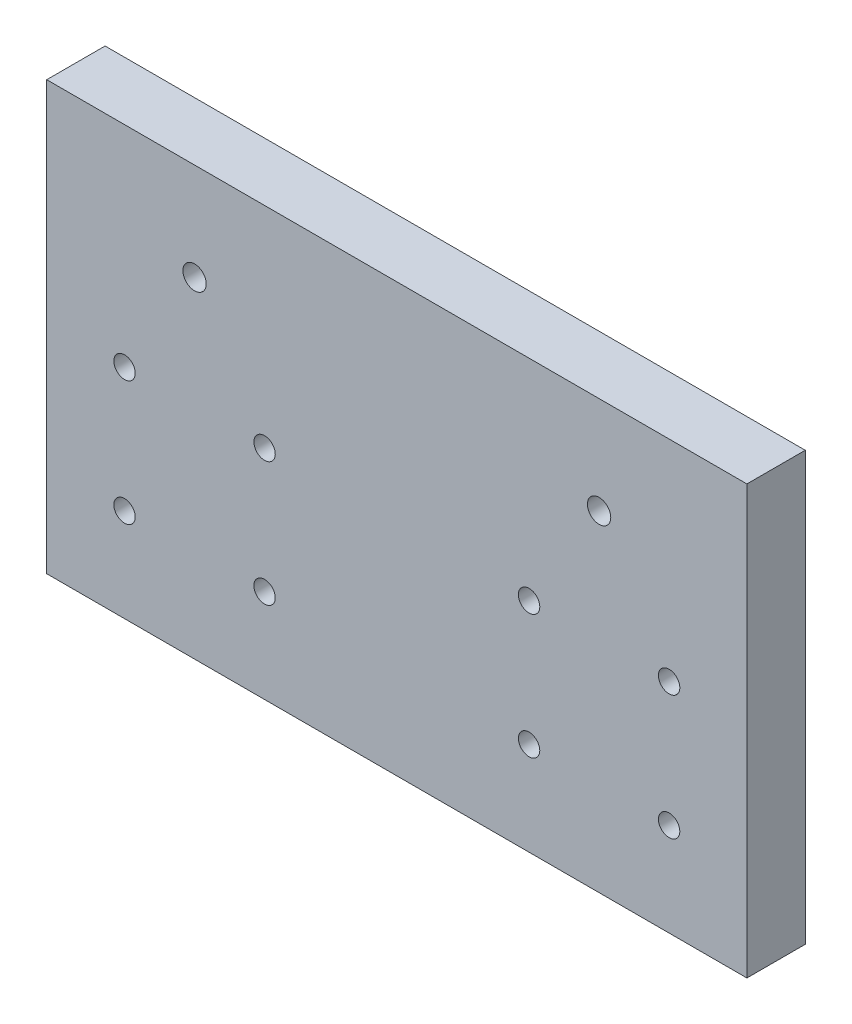
ISO-10303-21;
HEADER;
FILE_DESCRIPTION(('STEP AP214'),'2;1');
FILE_NAME('part.step','',(''),(''),'','','');
FILE_SCHEMA(('AUTOMOTIVE_DESIGN { 1 0 10303 214 1 1 1 1 }'));
ENDSEC;
DATA;
#1=APPLICATION_CONTEXT('core data for automotive mechanical design processes');
#2=APPLICATION_PROTOCOL_DEFINITION('international standard','automotive_design',2000,#1);
#3=PRODUCT_CONTEXT('',#1,'mechanical');
#4=PRODUCT('Part','Part','',(#3));
#5=PRODUCT_RELATED_PRODUCT_CATEGORY('part','',(#4));
#6=PRODUCT_DEFINITION_FORMATION('','',#4);
#7=PRODUCT_DEFINITION_CONTEXT('part definition',#1,'design');
#8=PRODUCT_DEFINITION('design','',#6,#7);
#9=PRODUCT_DEFINITION_SHAPE('','',#8);
#10=(LENGTH_UNIT() NAMED_UNIT(*) SI_UNIT(.MILLI.,.METRE.));
#11=(NAMED_UNIT(*) PLANE_ANGLE_UNIT() SI_UNIT($,.RADIAN.));
#12=(NAMED_UNIT(*) SI_UNIT($,.STERADIAN.) SOLID_ANGLE_UNIT());
#13=UNCERTAINTY_MEASURE_WITH_UNIT(LENGTH_MEASURE(1.E-05),#10,'distance_accuracy_value','');
#14=(GEOMETRIC_REPRESENTATION_CONTEXT(3) GLOBAL_UNCERTAINTY_ASSIGNED_CONTEXT((#13)) GLOBAL_UNIT_ASSIGNED_CONTEXT((#10,
#11,#12)) REPRESENTATION_CONTEXT('',''));
#15=CARTESIAN_POINT('',(0.,0.,0.));
#16=DIRECTION('',(0.,0.,1.));
#17=DIRECTION('',(1.,0.,0.));
#18=AXIS2_PLACEMENT_3D('',#15,#16,#17);
#19=CARTESIAN_POINT('',(-90.,0.,15.));
#20=DIRECTION('',(1.,0.,0.));
#21=DIRECTION('',(0.,0.,-1.));
#22=AXIS2_PLACEMENT_3D('',#19,#20,#21);
#23=PLANE('',#22);
#24=DIRECTION('',(0.,-1.,0.));
#25=VECTOR('',#24,1.);
#26=CARTESIAN_POINT('',(-90.,0.,0.));
#27=LINE('',#26,#25);
#28=CARTESIAN_POINT('',(-90.,110.,0.));
#29=VERTEX_POINT('',#28);
#30=CARTESIAN_POINT('',(-90.,0.,0.));
#31=VERTEX_POINT('',#30);
#32=EDGE_CURVE('E101',#29,#31,#27,.T.);
#33=ORIENTED_EDGE('',*,*,#32,.T.);
#34=DIRECTION('',(0.,0.,-1.));
#35=VECTOR('',#34,1.);
#36=CARTESIAN_POINT('',(-90.,0.,15.));
#37=LINE('',#36,#35);
#38=CARTESIAN_POINT('',(-90.,0.,15.));
#39=VERTEX_POINT('',#38);
#40=EDGE_CURVE('E11',#39,#31,#37,.T.);
#41=ORIENTED_EDGE('',*,*,#40,.F.);
#42=DIRECTION('',(0.,-1.,0.));
#43=VECTOR('',#42,1.);
#44=CARTESIAN_POINT('',(-90.,0.,15.));
#45=LINE('',#44,#43);
#46=CARTESIAN_POINT('',(-90.,110.,15.));
#47=VERTEX_POINT('',#46);
#48=EDGE_CURVE('E88',#47,#39,#45,.T.);
#49=ORIENTED_EDGE('',*,*,#48,.F.);
#50=DIRECTION('',(0.,0.,-1.));
#51=VECTOR('',#50,1.);
#52=CARTESIAN_POINT('',(-90.,110.,15.));
#53=LINE('',#52,#51);
#54=EDGE_CURVE('E97',#47,#29,#53,.T.);
#55=ORIENTED_EDGE('',*,*,#54,.T.);
#56=EDGE_LOOP('',(#33,#41,#49,#55));
#57=FACE_BOUND('',#56,.T.);
#58=ADVANCED_FACE('F35',(#57),#23,.F.);
#59=CARTESIAN_POINT('',(-90.,0.,15.));
#60=DIRECTION('',(0.,1.,0.));
#61=DIRECTION('',(0.,0.,1.));
#62=AXIS2_PLACEMENT_3D('',#59,#60,#61);
#63=PLANE('',#62);
#64=DIRECTION('',(1.,0.,0.));
#65=VECTOR('',#64,1.);
#66=CARTESIAN_POINT('',(-90.,0.,0.));
#67=LINE('',#66,#65);
#68=CARTESIAN_POINT('',(90.,0.,0.));
#69=VERTEX_POINT('',#68);
#70=EDGE_CURVE('E92',#31,#69,#67,.T.);
#71=ORIENTED_EDGE('',*,*,#70,.T.);
#72=DIRECTION('',(0.,0.,-1.));
#73=VECTOR('',#72,1.);
#74=CARTESIAN_POINT('',(90.,0.,15.));
#75=LINE('',#74,#73);
#76=CARTESIAN_POINT('',(90.,0.,15.));
#77=VERTEX_POINT('',#76);
#78=EDGE_CURVE('E44',#77,#69,#75,.T.);
#79=ORIENTED_EDGE('',*,*,#78,.F.);
#80=DIRECTION('',(1.,0.,0.));
#81=VECTOR('',#80,1.);
#82=CARTESIAN_POINT('',(-90.,0.,15.));
#83=LINE('',#82,#81);
#84=EDGE_CURVE('E83',#39,#77,#83,.T.);
#85=ORIENTED_EDGE('',*,*,#84,.F.);
#86=ORIENTED_EDGE('',*,*,#40,.T.);
#87=EDGE_LOOP('',(#71,#79,#85,#86));
#88=FACE_BOUND('',#87,.T.);
#89=ADVANCED_FACE('F91',(#88),#63,.F.);
#90=CARTESIAN_POINT('',(90.,0.,15.));
#91=DIRECTION('',(-1.,0.,0.));
#92=DIRECTION('',(0.,0.,1.));
#93=AXIS2_PLACEMENT_3D('',#90,#91,#92);
#94=PLANE('',#93);
#95=DIRECTION('',(0.,1.,0.));
#96=VECTOR('',#95,1.);
#97=CARTESIAN_POINT('',(90.,0.,0.));
#98=LINE('',#97,#96);
#99=CARTESIAN_POINT('',(90.,110.,0.));
#100=VERTEX_POINT('',#99);
#101=EDGE_CURVE('E70',#69,#100,#98,.T.);
#102=ORIENTED_EDGE('',*,*,#101,.T.);
#103=DIRECTION('',(0.,0.,-1.));
#104=VECTOR('',#103,1.);
#105=CARTESIAN_POINT('',(90.,110.,15.));
#106=LINE('',#105,#104);
#107=CARTESIAN_POINT('',(90.,110.,15.));
#108=VERTEX_POINT('',#107);
#109=EDGE_CURVE('E93',#108,#100,#106,.T.);
#110=ORIENTED_EDGE('',*,*,#109,.F.);
#111=DIRECTION('',(0.,1.,0.));
#112=VECTOR('',#111,1.);
#113=CARTESIAN_POINT('',(90.,0.,15.));
#114=LINE('',#113,#112);
#115=EDGE_CURVE('E86',#77,#108,#114,.T.);
#116=ORIENTED_EDGE('',*,*,#115,.F.);
#117=ORIENTED_EDGE('',*,*,#78,.T.);
#118=EDGE_LOOP('',(#102,#110,#116,#117));
#119=FACE_BOUND('',#118,.T.);
#120=ADVANCED_FACE('F95',(#119),#94,.F.);
#121=CARTESIAN_POINT('',(-90.,110.,15.));
#122=DIRECTION('',(0.,-1.,0.));
#123=DIRECTION('',(0.,0.,-1.));
#124=AXIS2_PLACEMENT_3D('',#121,#122,#123);
#125=PLANE('',#124);
#126=DIRECTION('',(-1.,0.,0.));
#127=VECTOR('',#126,1.);
#128=CARTESIAN_POINT('',(-90.,110.,0.));
#129=LINE('',#128,#127);
#130=EDGE_CURVE('E76',#100,#29,#129,.T.);
#131=ORIENTED_EDGE('',*,*,#130,.T.);
#132=ORIENTED_EDGE('',*,*,#54,.F.);
#133=DIRECTION('',(-1.,0.,0.));
#134=VECTOR('',#133,1.);
#135=CARTESIAN_POINT('',(-90.,110.,15.));
#136=LINE('',#135,#134);
#137=EDGE_CURVE('E53',#108,#47,#136,.T.);
#138=ORIENTED_EDGE('',*,*,#137,.F.);
#139=ORIENTED_EDGE('',*,*,#109,.T.);
#140=EDGE_LOOP('',(#131,#132,#138,#139));
#141=FACE_BOUND('',#140,.T.);
#142=ADVANCED_FACE('F175',(#141),#125,.F.);
#143=CARTESIAN_POINT('',(0.,0.,15.));
#144=DIRECTION('',(0.,0.,-1.));
#145=DIRECTION('',(-1.,0.,0.));
#146=AXIS2_PLACEMENT_3D('',#143,#144,#145);
#147=PLANE('',#146);
#148=CARTESIAN_POINT('',(52.,85.,15.));
#149=DIRECTION('',(0.,0.,1.));
#150=DIRECTION('',(1.,0.,0.));
#151=AXIS2_PLACEMENT_3D('',#148,#149,#150);
#152=CIRCLE('',#151,3.);
#153=CARTESIAN_POINT('',(55.,85.,15.));
#154=VERTEX_POINT('',#153);
#155=EDGE_CURVE('E135',#154,#154,#152,.T.);
#156=ORIENTED_EDGE('',*,*,#155,.F.);
#157=EDGE_LOOP('',(#156));
#158=FACE_BOUND('',#157,.T.);
#159=CARTESIAN_POINT('',(-52.,85.,15.));
#160=DIRECTION('',(0.,0.,1.));
#161=DIRECTION('',(-1.,0.,0.));
#162=AXIS2_PLACEMENT_3D('',#159,#160,#161);
#163=CIRCLE('',#162,3.);
#164=CARTESIAN_POINT('',(-55.,85.,15.));
#165=VERTEX_POINT('',#164);
#166=EDGE_CURVE('E141',#165,#165,#163,.T.);
#167=ORIENTED_EDGE('',*,*,#166,.F.);
#168=EDGE_LOOP('',(#167));
#169=FACE_BOUND('',#168,.T.);
#170=CARTESIAN_POINT('',(70.,24.,15.));
#171=DIRECTION('',(0.,0.,1.));
#172=DIRECTION('',(1.,0.,0.));
#173=AXIS2_PLACEMENT_3D('',#170,#171,#172);
#174=CIRCLE('',#173,2.75000000000001);
#175=CARTESIAN_POINT('',(72.75,24.,15.));
#176=VERTEX_POINT('',#175);
#177=EDGE_CURVE('E157',#176,#176,#174,.T.);
#178=ORIENTED_EDGE('',*,*,#177,.F.);
#179=EDGE_LOOP('',(#178));
#180=FACE_BOUND('',#179,.T.);
#181=CARTESIAN_POINT('',(70.,56.,15.));
#182=DIRECTION('',(0.,0.,1.));
#183=DIRECTION('',(-1.,0.,0.));
#184=AXIS2_PLACEMENT_3D('',#181,#182,#183);
#185=CIRCLE('',#184,2.75000000000001);
#186=CARTESIAN_POINT('',(67.25,56.,15.));
#187=VERTEX_POINT('',#186);
#188=EDGE_CURVE('E160',#187,#187,#185,.T.);
#189=ORIENTED_EDGE('',*,*,#188,.F.);
#190=EDGE_LOOP('',(#189));
#191=FACE_BOUND('',#190,.T.);
#192=CARTESIAN_POINT('',(34.,56.,15.));
#193=DIRECTION('',(0.,0.,1.));
#194=DIRECTION('',(-1.,0.,0.));
#195=AXIS2_PLACEMENT_3D('',#192,#193,#194);
#196=CIRCLE('',#195,2.75);
#197=CARTESIAN_POINT('',(31.25,56.,15.));
#198=VERTEX_POINT('',#197);
#199=EDGE_CURVE('E163',#198,#198,#196,.T.);
#200=ORIENTED_EDGE('',*,*,#199,.F.);
#201=EDGE_LOOP('',(#200));
#202=FACE_BOUND('',#201,.T.);
#203=CARTESIAN_POINT('',(-34.,24.,15.));
#204=DIRECTION('',(0.,0.,1.));
#205=DIRECTION('',(-1.,0.,0.));
#206=AXIS2_PLACEMENT_3D('',#203,#204,#205);
#207=CIRCLE('',#206,2.74999999999999);
#208=CARTESIAN_POINT('',(-36.75,24.,15.));
#209=VERTEX_POINT('',#208);
#210=EDGE_CURVE('E151',#209,#209,#207,.T.);
#211=ORIENTED_EDGE('',*,*,#210,.F.);
#212=EDGE_LOOP('',(#211));
#213=FACE_BOUND('',#212,.T.);
#214=CARTESIAN_POINT('',(-70.,24.,15.));
#215=DIRECTION('',(0.,0.,1.));
#216=DIRECTION('',(-1.,0.,0.));
#217=AXIS2_PLACEMENT_3D('',#214,#215,#216);
#218=CIRCLE('',#217,2.75000000000001);
#219=CARTESIAN_POINT('',(-72.75,24.,15.));
#220=VERTEX_POINT('',#219);
#221=EDGE_CURVE('E148',#220,#220,#218,.T.);
#222=ORIENTED_EDGE('',*,*,#221,.F.);
#223=EDGE_LOOP('',(#222));
#224=FACE_BOUND('',#223,.T.);
#225=CARTESIAN_POINT('',(-70.,56.,15.));
#226=DIRECTION('',(0.,0.,1.));
#227=DIRECTION('',(1.,0.,0.));
#228=AXIS2_PLACEMENT_3D('',#225,#226,#227);
#229=CIRCLE('',#228,2.75000000000001);
#230=CARTESIAN_POINT('',(-67.25,56.,15.));
#231=VERTEX_POINT('',#230);
#232=EDGE_CURVE('E152',#231,#231,#229,.T.);
#233=ORIENTED_EDGE('',*,*,#232,.F.);
#234=EDGE_LOOP('',(#233));
#235=FACE_BOUND('',#234,.T.);
#236=CARTESIAN_POINT('',(-34.,56.,15.));
#237=DIRECTION('',(0.,0.,1.));
#238=DIRECTION('',(1.,0.,0.));
#239=AXIS2_PLACEMENT_3D('',#236,#237,#238);
#240=CIRCLE('',#239,2.75);
#241=CARTESIAN_POINT('',(-31.25,56.,15.));
#242=VERTEX_POINT('',#241);
#243=EDGE_CURVE('E139',#242,#242,#240,.T.);
#244=ORIENTED_EDGE('',*,*,#243,.F.);
#245=EDGE_LOOP('',(#244));
#246=FACE_BOUND('',#245,.T.);
#247=CARTESIAN_POINT('',(34.,24.,15.));
#248=DIRECTION('',(0.,0.,1.));
#249=DIRECTION('',(1.,0.,0.));
#250=AXIS2_PLACEMENT_3D('',#247,#248,#249);
#251=CIRCLE('',#250,2.74999999999999);
#252=CARTESIAN_POINT('',(36.75,24.,15.));
#253=VERTEX_POINT('',#252);
#254=EDGE_CURVE('E114',#253,#253,#251,.T.);
#255=ORIENTED_EDGE('',*,*,#254,.F.);
#256=EDGE_LOOP('',(#255));
#257=FACE_BOUND('',#256,.T.);
#258=ORIENTED_EDGE('',*,*,#48,.T.);
#259=ORIENTED_EDGE('',*,*,#84,.T.);
#260=ORIENTED_EDGE('',*,*,#115,.T.);
#261=ORIENTED_EDGE('',*,*,#137,.T.);
#262=EDGE_LOOP('',(#258,#259,#260,#261));
#263=FACE_BOUND('',#262,.T.);
#264=ADVANCED_FACE('F84',(#158,#169,#180,#191,#202,#213,#224,#235,#246,#257,#263),#147,.F.);
#265=CARTESIAN_POINT('',(0.,0.,0.));
#266=DIRECTION('',(0.,0.,-1.));
#267=DIRECTION('',(-1.,0.,0.));
#268=AXIS2_PLACEMENT_3D('',#265,#266,#267);
#269=PLANE('',#268);
#270=CARTESIAN_POINT('',(52.,85.,0.));
#271=DIRECTION('',(0.,0.,-1.));
#272=DIRECTION('',(-1.,0.,0.));
#273=AXIS2_PLACEMENT_3D('',#270,#271,#272);
#274=CIRCLE('',#273,3.);
#275=CARTESIAN_POINT('',(49.,85.,0.));
#276=VERTEX_POINT('',#275);
#277=EDGE_CURVE('E38',#276,#276,#274,.T.);
#278=ORIENTED_EDGE('',*,*,#277,.F.);
#279=EDGE_LOOP('',(#278));
#280=FACE_BOUND('',#279,.T.);
#281=CARTESIAN_POINT('',(-52.,85.,0.));
#282=DIRECTION('',(0.,0.,-1.));
#283=DIRECTION('',(-1.,0.,0.));
#284=AXIS2_PLACEMENT_3D('',#281,#282,#283);
#285=CIRCLE('',#284,3.);
#286=CARTESIAN_POINT('',(-55.,85.,0.));
#287=VERTEX_POINT('',#286);
#288=EDGE_CURVE('E133',#287,#287,#285,.T.);
#289=ORIENTED_EDGE('',*,*,#288,.F.);
#290=EDGE_LOOP('',(#289));
#291=FACE_BOUND('',#290,.T.);
#292=CARTESIAN_POINT('',(70.,24.,0.));
#293=DIRECTION('',(0.,0.,-1.));
#294=DIRECTION('',(-1.,0.,0.));
#295=AXIS2_PLACEMENT_3D('',#292,#293,#294);
#296=CIRCLE('',#295,2.75000000000001);
#297=CARTESIAN_POINT('',(67.25,24.,0.));
#298=VERTEX_POINT('',#297);
#299=EDGE_CURVE('E104',#298,#298,#296,.T.);
#300=ORIENTED_EDGE('',*,*,#299,.F.);
#301=EDGE_LOOP('',(#300));
#302=FACE_BOUND('',#301,.T.);
#303=CARTESIAN_POINT('',(70.,56.,0.));
#304=DIRECTION('',(0.,0.,-1.));
#305=DIRECTION('',(-1.,0.,0.));
#306=AXIS2_PLACEMENT_3D('',#303,#304,#305);
#307=CIRCLE('',#306,2.75000000000001);
#308=CARTESIAN_POINT('',(67.25,56.,0.));
#309=VERTEX_POINT('',#308);
#310=EDGE_CURVE('E129',#309,#309,#307,.T.);
#311=ORIENTED_EDGE('',*,*,#310,.F.);
#312=EDGE_LOOP('',(#311));
#313=FACE_BOUND('',#312,.T.);
#314=CARTESIAN_POINT('',(34.,56.,0.));
#315=DIRECTION('',(0.,0.,-1.));
#316=DIRECTION('',(-1.,0.,0.));
#317=AXIS2_PLACEMENT_3D('',#314,#315,#316);
#318=CIRCLE('',#317,2.75);
#319=CARTESIAN_POINT('',(31.25,56.,0.));
#320=VERTEX_POINT('',#319);
#321=EDGE_CURVE('E126',#320,#320,#318,.T.);
#322=ORIENTED_EDGE('',*,*,#321,.F.);
#323=EDGE_LOOP('',(#322));
#324=FACE_BOUND('',#323,.T.);
#325=CARTESIAN_POINT('',(-34.,24.,0.));
#326=DIRECTION('',(0.,0.,-1.));
#327=DIRECTION('',(-1.,0.,0.));
#328=AXIS2_PLACEMENT_3D('',#325,#326,#327);
#329=CIRCLE('',#328,2.74999999999999);
#330=CARTESIAN_POINT('',(-36.75,24.,0.));
#331=VERTEX_POINT('',#330);
#332=EDGE_CURVE('E123',#331,#331,#329,.T.);
#333=ORIENTED_EDGE('',*,*,#332,.F.);
#334=EDGE_LOOP('',(#333));
#335=FACE_BOUND('',#334,.T.);
#336=CARTESIAN_POINT('',(-70.,24.,0.));
#337=DIRECTION('',(0.,0.,-1.));
#338=DIRECTION('',(-1.,0.,0.));
#339=AXIS2_PLACEMENT_3D('',#336,#337,#338);
#340=CIRCLE('',#339,2.75000000000001);
#341=CARTESIAN_POINT('',(-72.75,24.,0.));
#342=VERTEX_POINT('',#341);
#343=EDGE_CURVE('E120',#342,#342,#340,.T.);
#344=ORIENTED_EDGE('',*,*,#343,.F.);
#345=EDGE_LOOP('',(#344));
#346=FACE_BOUND('',#345,.T.);
#347=CARTESIAN_POINT('',(-70.,56.,0.));
#348=DIRECTION('',(0.,0.,-1.));
#349=DIRECTION('',(-1.,0.,0.));
#350=AXIS2_PLACEMENT_3D('',#347,#348,#349);
#351=CIRCLE('',#350,2.75000000000001);
#352=CARTESIAN_POINT('',(-72.75,56.,0.));
#353=VERTEX_POINT('',#352);
#354=EDGE_CURVE('E117',#353,#353,#351,.T.);
#355=ORIENTED_EDGE('',*,*,#354,.F.);
#356=EDGE_LOOP('',(#355));
#357=FACE_BOUND('',#356,.T.);
#358=CARTESIAN_POINT('',(-34.,56.,0.));
#359=DIRECTION('',(0.,0.,-1.));
#360=DIRECTION('',(-1.,0.,0.));
#361=AXIS2_PLACEMENT_3D('',#358,#359,#360);
#362=CIRCLE('',#361,2.75);
#363=CARTESIAN_POINT('',(-36.75,56.,0.));
#364=VERTEX_POINT('',#363);
#365=EDGE_CURVE('E113',#364,#364,#362,.T.);
#366=ORIENTED_EDGE('',*,*,#365,.F.);
#367=EDGE_LOOP('',(#366));
#368=FACE_BOUND('',#367,.T.);
#369=CARTESIAN_POINT('',(34.,24.,0.));
#370=DIRECTION('',(0.,0.,-1.));
#371=DIRECTION('',(-1.,0.,0.));
#372=AXIS2_PLACEMENT_3D('',#369,#370,#371);
#373=CIRCLE('',#372,2.74999999999999);
#374=CARTESIAN_POINT('',(31.25,24.,0.));
#375=VERTEX_POINT('',#374);
#376=EDGE_CURVE('E110',#375,#375,#373,.T.);
#377=ORIENTED_EDGE('',*,*,#376,.F.);
#378=EDGE_LOOP('',(#377));
#379=FACE_BOUND('',#378,.T.);
#380=ORIENTED_EDGE('',*,*,#32,.F.);
#381=ORIENTED_EDGE('',*,*,#130,.F.);
#382=ORIENTED_EDGE('',*,*,#101,.F.);
#383=ORIENTED_EDGE('',*,*,#70,.F.);
#384=EDGE_LOOP('',(#380,#381,#382,#383));
#385=FACE_BOUND('',#384,.T.);
#386=ADVANCED_FACE('F174',(#280,#291,#302,#313,#324,#335,#346,#357,#368,#379,#385),#269,.T.);
#387=CARTESIAN_POINT('',(34.,24.,-25.));
#388=DIRECTION('',(0.,0.,1.));
#389=DIRECTION('',(1.,0.,0.));
#390=AXIS2_PLACEMENT_3D('',#387,#388,#389);
#391=CYLINDRICAL_SURFACE('',#390,2.74999999999999);
#392=ORIENTED_EDGE('',*,*,#376,.T.);
#393=EDGE_LOOP('',(#392));
#394=FACE_BOUND('',#393,.T.);
#395=ORIENTED_EDGE('',*,*,#254,.T.);
#396=EDGE_LOOP('',(#395));
#397=FACE_BOUND('',#396,.T.);
#398=ADVANCED_FACE('F171',(#394,#397),#391,.F.);
#399=CARTESIAN_POINT('',(-34.,56.,-25.));
#400=DIRECTION('',(0.,0.,1.));
#401=DIRECTION('',(1.,0.,0.));
#402=AXIS2_PLACEMENT_3D('',#399,#400,#401);
#403=CYLINDRICAL_SURFACE('',#402,2.75);
#404=ORIENTED_EDGE('',*,*,#365,.T.);
#405=EDGE_LOOP('',(#404));
#406=FACE_BOUND('',#405,.T.);
#407=ORIENTED_EDGE('',*,*,#243,.T.);
#408=EDGE_LOOP('',(#407));
#409=FACE_BOUND('',#408,.T.);
#410=ADVANCED_FACE('F214',(#406,#409),#403,.F.);
#411=CARTESIAN_POINT('',(-70.,56.,-25.));
#412=DIRECTION('',(0.,0.,1.));
#413=DIRECTION('',(1.,0.,0.));
#414=AXIS2_PLACEMENT_3D('',#411,#412,#413);
#415=CYLINDRICAL_SURFACE('',#414,2.75000000000001);
#416=ORIENTED_EDGE('',*,*,#354,.T.);
#417=EDGE_LOOP('',(#416));
#418=FACE_BOUND('',#417,.T.);
#419=ORIENTED_EDGE('',*,*,#232,.T.);
#420=EDGE_LOOP('',(#419));
#421=FACE_BOUND('',#420,.T.);
#422=ADVANCED_FACE('F224',(#418,#421),#415,.F.);
#423=CARTESIAN_POINT('',(-70.,24.,-25.));
#424=DIRECTION('',(0.,0.,1.));
#425=DIRECTION('',(1.,0.,0.));
#426=AXIS2_PLACEMENT_3D('',#423,#424,#425);
#427=CYLINDRICAL_SURFACE('',#426,2.75000000000001);
#428=ORIENTED_EDGE('',*,*,#343,.T.);
#429=EDGE_LOOP('',(#428));
#430=FACE_BOUND('',#429,.T.);
#431=ORIENTED_EDGE('',*,*,#221,.T.);
#432=EDGE_LOOP('',(#431));
#433=FACE_BOUND('',#432,.T.);
#434=ADVANCED_FACE('F234',(#430,#433),#427,.F.);
#435=CARTESIAN_POINT('',(-34.,24.,-25.));
#436=DIRECTION('',(0.,0.,1.));
#437=DIRECTION('',(1.,0.,0.));
#438=AXIS2_PLACEMENT_3D('',#435,#436,#437);
#439=CYLINDRICAL_SURFACE('',#438,2.74999999999999);
#440=ORIENTED_EDGE('',*,*,#332,.T.);
#441=EDGE_LOOP('',(#440));
#442=FACE_BOUND('',#441,.T.);
#443=ORIENTED_EDGE('',*,*,#210,.T.);
#444=EDGE_LOOP('',(#443));
#445=FACE_BOUND('',#444,.T.);
#446=ADVANCED_FACE('F244',(#442,#445),#439,.F.);
#447=CARTESIAN_POINT('',(34.,56.,-25.));
#448=DIRECTION('',(0.,0.,1.));
#449=DIRECTION('',(1.,0.,0.));
#450=AXIS2_PLACEMENT_3D('',#447,#448,#449);
#451=CYLINDRICAL_SURFACE('',#450,2.75);
#452=ORIENTED_EDGE('',*,*,#321,.T.);
#453=EDGE_LOOP('',(#452));
#454=FACE_BOUND('',#453,.T.);
#455=ORIENTED_EDGE('',*,*,#199,.T.);
#456=EDGE_LOOP('',(#455));
#457=FACE_BOUND('',#456,.T.);
#458=ADVANCED_FACE('F254',(#454,#457),#451,.F.);
#459=CARTESIAN_POINT('',(70.,56.,-25.));
#460=DIRECTION('',(0.,0.,1.));
#461=DIRECTION('',(1.,0.,0.));
#462=AXIS2_PLACEMENT_3D('',#459,#460,#461);
#463=CYLINDRICAL_SURFACE('',#462,2.75000000000001);
#464=ORIENTED_EDGE('',*,*,#310,.T.);
#465=EDGE_LOOP('',(#464));
#466=FACE_BOUND('',#465,.T.);
#467=ORIENTED_EDGE('',*,*,#188,.T.);
#468=EDGE_LOOP('',(#467));
#469=FACE_BOUND('',#468,.T.);
#470=ADVANCED_FACE('F264',(#466,#469),#463,.F.);
#471=CARTESIAN_POINT('',(70.,24.,-25.));
#472=DIRECTION('',(0.,0.,1.));
#473=DIRECTION('',(1.,0.,0.));
#474=AXIS2_PLACEMENT_3D('',#471,#472,#473);
#475=CYLINDRICAL_SURFACE('',#474,2.75000000000001);
#476=ORIENTED_EDGE('',*,*,#299,.T.);
#477=EDGE_LOOP('',(#476));
#478=FACE_BOUND('',#477,.T.);
#479=ORIENTED_EDGE('',*,*,#177,.T.);
#480=EDGE_LOOP('',(#479));
#481=FACE_BOUND('',#480,.T.);
#482=ADVANCED_FACE('F274',(#478,#481),#475,.F.);
#483=CARTESIAN_POINT('',(-52.,85.,-25.));
#484=DIRECTION('',(0.,0.,1.));
#485=DIRECTION('',(1.,0.,0.));
#486=AXIS2_PLACEMENT_3D('',#483,#484,#485);
#487=CYLINDRICAL_SURFACE('',#486,3.);
#488=ORIENTED_EDGE('',*,*,#288,.T.);
#489=EDGE_LOOP('',(#488));
#490=FACE_BOUND('',#489,.T.);
#491=ORIENTED_EDGE('',*,*,#166,.T.);
#492=EDGE_LOOP('',(#491));
#493=FACE_BOUND('',#492,.T.);
#494=ADVANCED_FACE('F283',(#490,#493),#487,.F.);
#495=CARTESIAN_POINT('',(52.,85.,-25.));
#496=DIRECTION('',(0.,0.,1.));
#497=DIRECTION('',(1.,0.,0.));
#498=AXIS2_PLACEMENT_3D('',#495,#496,#497);
#499=CYLINDRICAL_SURFACE('',#498,3.);
#500=ORIENTED_EDGE('',*,*,#277,.T.);
#501=EDGE_LOOP('',(#500));
#502=FACE_BOUND('',#501,.T.);
#503=ORIENTED_EDGE('',*,*,#155,.T.);
#504=EDGE_LOOP('',(#503));
#505=FACE_BOUND('',#504,.T.);
#506=ADVANCED_FACE('F302',(#502,#505),#499,.F.);
#507=CLOSED_SHELL('',(#58,#89,#120,#142,#264,#386,#398,#410,#422,#434,#446,#458,#470,#482,#494,#506));
#508=MANIFOLD_SOLID_BREP('B2',#507);
#509=ADVANCED_BREP_SHAPE_REPRESENTATION('',(#18,#508),#14);
#510=SHAPE_DEFINITION_REPRESENTATION(#9,#509);
ENDSEC;
END-ISO-10303-21;
